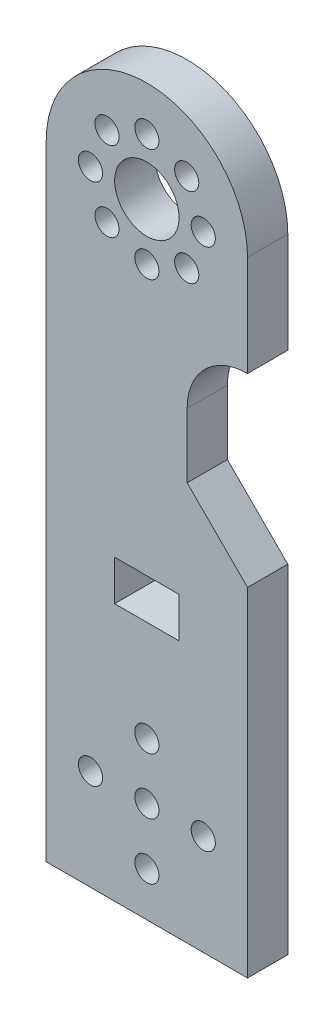
ISO-10303-21;
HEADER;
FILE_DESCRIPTION(('STEP AP214'),'2;1');
FILE_NAME('part.step','',(''),(''),'','','');
FILE_SCHEMA(('AUTOMOTIVE_DESIGN { 1 0 10303 214 1 1 1 1 }'));
ENDSEC;
DATA;
#1=APPLICATION_CONTEXT('core data for automotive mechanical design processes');
#2=APPLICATION_PROTOCOL_DEFINITION('international standard','automotive_design',2000,#1);
#3=PRODUCT_CONTEXT('',#1,'mechanical');
#4=PRODUCT('Part','Part','',(#3));
#5=PRODUCT_RELATED_PRODUCT_CATEGORY('part','',(#4));
#6=PRODUCT_DEFINITION_FORMATION('','',#4);
#7=PRODUCT_DEFINITION_CONTEXT('part definition',#1,'design');
#8=PRODUCT_DEFINITION('design','',#6,#7);
#9=PRODUCT_DEFINITION_SHAPE('','',#8);
#10=(LENGTH_UNIT() NAMED_UNIT(*) SI_UNIT(.MILLI.,.METRE.));
#11=(NAMED_UNIT(*) PLANE_ANGLE_UNIT() SI_UNIT($,.RADIAN.));
#12=(NAMED_UNIT(*) SI_UNIT($,.STERADIAN.) SOLID_ANGLE_UNIT());
#13=UNCERTAINTY_MEASURE_WITH_UNIT(LENGTH_MEASURE(1.E-05),#10,'distance_accuracy_value','');
#14=(GEOMETRIC_REPRESENTATION_CONTEXT(3) GLOBAL_UNCERTAINTY_ASSIGNED_CONTEXT((#13)) GLOBAL_UNIT_ASSIGNED_CONTEXT((#10,
#11,#12)) REPRESENTATION_CONTEXT('',''));
#15=CARTESIAN_POINT('',(0.,0.,0.));
#16=DIRECTION('',(0.,0.,1.));
#17=DIRECTION('',(1.,0.,0.));
#18=AXIS2_PLACEMENT_3D('',#15,#16,#17);
#19=CARTESIAN_POINT('',(12.5,0.,5.));
#20=DIRECTION('',(1.,0.,0.));
#21=DIRECTION('',(0.,1.,0.));
#22=AXIS2_PLACEMENT_3D('',#19,#20,#21);
#23=PLANE('',#22);
#24=DIRECTION('',(0.,0.,1.));
#25=VECTOR('',#24,1.);
#26=CARTESIAN_POINT('',(12.5,-12.5,-5.));
#27=LINE('',#26,#25);
#28=CARTESIAN_POINT('',(12.5,-12.5,0.));
#29=VERTEX_POINT('',#28);
#30=CARTESIAN_POINT('',(12.5,-12.5,5.));
#31=VERTEX_POINT('',#30);
#32=EDGE_CURVE('E145',#29,#31,#27,.T.);
#33=ORIENTED_EDGE('',*,*,#32,.F.);
#34=DIRECTION('',(0.,-1.,0.));
#35=VECTOR('',#34,1.);
#36=CARTESIAN_POINT('',(12.5,0.,0.));
#37=LINE('',#36,#35);
#38=CARTESIAN_POINT('',(12.5,0.,0.));
#39=VERTEX_POINT('',#38);
#40=EDGE_CURVE('E195',#39,#29,#37,.T.);
#41=ORIENTED_EDGE('',*,*,#40,.F.);
#42=DIRECTION('',(0.,0.,-1.));
#43=VECTOR('',#42,1.);
#44=CARTESIAN_POINT('',(12.5,0.,5.));
#45=LINE('',#44,#43);
#46=CARTESIAN_POINT('',(12.5,0.,5.));
#47=VERTEX_POINT('',#46);
#48=EDGE_CURVE('E215',#47,#39,#45,.T.);
#49=ORIENTED_EDGE('',*,*,#48,.F.);
#50=DIRECTION('',(0.,-1.,0.));
#51=VECTOR('',#50,1.);
#52=CARTESIAN_POINT('',(12.5,0.,5.));
#53=LINE('',#52,#51);
#54=EDGE_CURVE('E151',#47,#31,#53,.T.);
#55=ORIENTED_EDGE('',*,*,#54,.T.);
#56=EDGE_LOOP('',(#33,#41,#49,#55));
#57=FACE_BOUND('',#56,.T.);
#58=ADVANCED_FACE('F36',(#57),#23,.T.);
#59=CARTESIAN_POINT('',(0.,0.,5.));
#60=DIRECTION('',(0.,0.,1.));
#61=DIRECTION('',(1.,0.,0.));
#62=AXIS2_PLACEMENT_3D('',#59,#60,#61);
#63=PLANE('',#62);
#64=DIRECTION('',(0.707106781186549,-0.707106781186546,0.));
#65=VECTOR('',#64,1.);
#66=CARTESIAN_POINT('',(5.,-28.,5.));
#67=LINE('',#66,#65);
#68=CARTESIAN_POINT('',(5.,-28.,5.));
#69=VERTEX_POINT('',#68);
#70=CARTESIAN_POINT('',(12.5,-35.5,5.));
#71=VERTEX_POINT('',#70);
#72=EDGE_CURVE('E126',#69,#71,#67,.T.);
#73=ORIENTED_EDGE('',*,*,#72,.F.);
#74=DIRECTION('',(0.,-1.,0.));
#75=VECTOR('',#74,1.);
#76=CARTESIAN_POINT('',(5.,-20.0000000000001,5.));
#77=LINE('',#76,#75);
#78=CARTESIAN_POINT('',(5.,-20.0000000000001,5.));
#79=VERTEX_POINT('',#78);
#80=EDGE_CURVE('E136',#79,#69,#77,.T.);
#81=ORIENTED_EDGE('',*,*,#80,.F.);
#82=CARTESIAN_POINT('',(12.5,-20.,5.));
#83=DIRECTION('',(0.,0.,1.));
#84=DIRECTION('',(1.,0.,0.));
#85=AXIS2_PLACEMENT_3D('',#82,#83,#84);
#86=CIRCLE('',#85,7.5);
#87=EDGE_CURVE('E248',#31,#79,#86,.T.);
#88=ORIENTED_EDGE('',*,*,#87,.F.);
#89=ORIENTED_EDGE('',*,*,#54,.F.);
#90=CARTESIAN_POINT('',(0.,0.,5.));
#91=DIRECTION('',(0.,0.,1.));
#92=DIRECTION('',(1.,0.,0.));
#93=AXIS2_PLACEMENT_3D('',#90,#91,#92);
#94=CIRCLE('',#93,12.5);
#95=CARTESIAN_POINT('',(-12.5,0.,5.));
#96=VERTEX_POINT('',#95);
#97=EDGE_CURVE('E155',#47,#96,#94,.T.);
#98=ORIENTED_EDGE('',*,*,#97,.T.);
#99=DIRECTION('',(0.,-1.,0.));
#100=VECTOR('',#99,1.);
#101=CARTESIAN_POINT('',(-12.5,0.,5.));
#102=LINE('',#101,#100);
#103=CARTESIAN_POINT('',(-12.5,-77.5,5.));
#104=VERTEX_POINT('',#103);
#105=EDGE_CURVE('E163',#96,#104,#102,.T.);
#106=ORIENTED_EDGE('',*,*,#105,.T.);
#107=DIRECTION('',(1.,0.,0.));
#108=VECTOR('',#107,1.);
#109=CARTESIAN_POINT('',(0.,-77.5,5.));
#110=LINE('',#109,#108);
#111=CARTESIAN_POINT('',(12.5,-77.5,5.));
#112=VERTEX_POINT('',#111);
#113=EDGE_CURVE('E149',#104,#112,#110,.T.);
#114=ORIENTED_EDGE('',*,*,#113,.T.);
#115=EDGE_CURVE('E142',#71,#112,#53,.T.);
#116=ORIENTED_EDGE('',*,*,#115,.F.);
#117=EDGE_LOOP('',(#73,#81,#88,#89,#98,#106,#114,#116));
#118=FACE_BOUND('',#117,.T.);
#119=CARTESIAN_POINT('',(7.,-65.,5.));
#120=DIRECTION('',(0.,0.,-1.));
#121=DIRECTION('',(-1.,0.,0.));
#122=AXIS2_PLACEMENT_3D('',#119,#120,#121);
#123=CIRCLE('',#122,1.5);
#124=CARTESIAN_POINT('',(5.50000000000001,-65.,5.));
#125=VERTEX_POINT('',#124);
#126=EDGE_CURVE('E277',#125,#125,#123,.T.);
#127=ORIENTED_EDGE('',*,*,#126,.T.);
#128=EDGE_LOOP('',(#127));
#129=FACE_BOUND('',#128,.T.);
#130=CARTESIAN_POINT('',(-4.94974746830577,4.94974746830589,5.));
#131=DIRECTION('',(0.,0.,1.));
#132=DIRECTION('',(1.,0.,0.));
#133=AXIS2_PLACEMENT_3D('',#130,#131,#132);
#134=CIRCLE('',#133,1.5);
#135=CARTESIAN_POINT('',(-3.44974746830577,4.94974746830589,5.));
#136=VERTEX_POINT('',#135);
#137=EDGE_CURVE('E152',#136,#136,#134,.T.);
#138=ORIENTED_EDGE('',*,*,#137,.F.);
#139=EDGE_LOOP('',(#138));
#140=FACE_BOUND('',#139,.T.);
#141=CARTESIAN_POINT('',(-6.9999999999998,-1.98523339633126E-13,5.));
#142=DIRECTION('',(0.,0.,1.));
#143=DIRECTION('',(1.,0.,0.));
#144=AXIS2_PLACEMENT_3D('',#141,#142,#143);
#145=CIRCLE('',#144,1.50000000000032);
#146=CARTESIAN_POINT('',(-5.49999999999948,-1.98523339633126E-13,5.));
#147=VERTEX_POINT('',#146);
#148=EDGE_CURVE('E157',#147,#147,#145,.T.);
#149=ORIENTED_EDGE('',*,*,#148,.F.);
#150=EDGE_LOOP('',(#149));
#151=FACE_BOUND('',#150,.T.);
#152=CARTESIAN_POINT('',(-4.9497474683055,-4.94974746830597,5.));
#153=DIRECTION('',(0.,0.,1.));
#154=DIRECTION('',(1.,0.,0.));
#155=AXIS2_PLACEMENT_3D('',#152,#153,#154);
#156=CIRCLE('',#155,1.50000000000042);
#157=CARTESIAN_POINT('',(-3.44974746830507,-4.94974746830597,5.));
#158=VERTEX_POINT('',#157);
#159=EDGE_CURVE('E320',#158,#158,#156,.T.);
#160=ORIENTED_EDGE('',*,*,#159,.F.);
#161=EDGE_LOOP('',(#160));
#162=FACE_BOUND('',#161,.T.);
#163=CARTESIAN_POINT('',(3.95332173747447E-13,-7.,5.));
#164=DIRECTION('',(0.,0.,1.));
#165=DIRECTION('',(1.,0.,0.));
#166=AXIS2_PLACEMENT_3D('',#163,#164,#165);
#167=CIRCLE('',#166,1.50000000000042);
#168=CARTESIAN_POINT('',(1.50000000000082,-7.,5.));
#169=VERTEX_POINT('',#168);
#170=EDGE_CURVE('E317',#169,#169,#167,.T.);
#171=ORIENTED_EDGE('',*,*,#170,.F.);
#172=EDGE_LOOP('',(#171));
#173=FACE_BOUND('',#172,.T.);
#174=CARTESIAN_POINT('',(4.94974746830617,-4.94974746830569,5.));
#175=DIRECTION('',(0.,0.,1.));
#176=DIRECTION('',(1.,0.,0.));
#177=AXIS2_PLACEMENT_3D('',#174,#175,#176);
#178=CIRCLE('',#177,1.50000000000032);
#179=CARTESIAN_POINT('',(6.44974746830649,-4.94974746830569,5.));
#180=VERTEX_POINT('',#179);
#181=EDGE_CURVE('E314',#180,#180,#178,.T.);
#182=ORIENTED_EDGE('',*,*,#181,.F.);
#183=EDGE_LOOP('',(#182));
#184=FACE_BOUND('',#183,.T.);
#185=CARTESIAN_POINT('',(7.0000000000002,1.97666086873723E-13,5.));
#186=DIRECTION('',(0.,0.,1.));
#187=DIRECTION('',(1.,0.,0.));
#188=AXIS2_PLACEMENT_3D('',#185,#186,#187);
#189=CIRCLE('',#188,1.50000000000015);
#190=CARTESIAN_POINT('',(8.50000000000035,1.97666086873723E-13,5.));
#191=VERTEX_POINT('',#190);
#192=EDGE_CURVE('E311',#191,#191,#189,.T.);
#193=ORIENTED_EDGE('',*,*,#192,.F.);
#194=EDGE_LOOP('',(#193));
#195=FACE_BOUND('',#194,.T.);
#196=CARTESIAN_POINT('',(4.94974746830584,4.94974746830582,5.));
#197=DIRECTION('',(0.,0.,1.));
#198=DIRECTION('',(1.,0.,0.));
#199=AXIS2_PLACEMENT_3D('',#196,#197,#198);
#200=CIRCLE('',#199,1.5);
#201=CARTESIAN_POINT('',(6.44974746830584,4.94974746830582,5.));
#202=VERTEX_POINT('',#201);
#203=EDGE_CURVE('E308',#202,#202,#200,.T.);
#204=ORIENTED_EDGE('',*,*,#203,.F.);
#205=EDGE_LOOP('',(#204));
#206=FACE_BOUND('',#205,.T.);
#207=CARTESIAN_POINT('',(0.,7.,5.));
#208=DIRECTION('',(0.,0.,1.));
#209=DIRECTION('',(1.,0.,0.));
#210=AXIS2_PLACEMENT_3D('',#207,#208,#209);
#211=CIRCLE('',#210,1.5);
#212=CARTESIAN_POINT('',(1.5,7.,5.));
#213=VERTEX_POINT('',#212);
#214=EDGE_CURVE('E305',#213,#213,#211,.T.);
#215=ORIENTED_EDGE('',*,*,#214,.F.);
#216=EDGE_LOOP('',(#215));
#217=FACE_BOUND('',#216,.T.);
#218=CARTESIAN_POINT('',(0.,0.,5.));
#219=DIRECTION('',(0.,0.,1.));
#220=DIRECTION('',(1.,0.,0.));
#221=AXIS2_PLACEMENT_3D('',#218,#219,#220);
#222=CIRCLE('',#221,4.);
#223=CARTESIAN_POINT('',(4.,0.,5.));
#224=VERTEX_POINT('',#223);
#225=EDGE_CURVE('E207',#224,#224,#222,.T.);
#226=ORIENTED_EDGE('',*,*,#225,.F.);
#227=EDGE_LOOP('',(#226));
#228=FACE_BOUND('',#227,.T.);
#229=DIRECTION('',(0.,1.,0.));
#230=VECTOR('',#229,1.);
#231=CARTESIAN_POINT('',(4.,-40.5000000000002,5.));
#232=LINE('',#231,#230);
#233=CARTESIAN_POINT('',(4.,-45.5000000000002,5.));
#234=VERTEX_POINT('',#233);
#235=CARTESIAN_POINT('',(4.,-40.5000000000002,5.));
#236=VERTEX_POINT('',#235);
#237=EDGE_CURVE('E59',#234,#236,#232,.T.);
#238=ORIENTED_EDGE('',*,*,#237,.F.);
#239=DIRECTION('',(1.,0.,0.));
#240=VECTOR('',#239,1.);
#241=CARTESIAN_POINT('',(-4.,-45.5000000000002,5.));
#242=LINE('',#241,#240);
#243=CARTESIAN_POINT('',(-4.,-45.5000000000002,5.));
#244=VERTEX_POINT('',#243);
#245=EDGE_CURVE('E293',#244,#234,#242,.T.);
#246=ORIENTED_EDGE('',*,*,#245,.F.);
#247=DIRECTION('',(0.,-1.,0.));
#248=VECTOR('',#247,1.);
#249=CARTESIAN_POINT('',(-4.,-40.5000000000002,5.));
#250=LINE('',#249,#248);
#251=CARTESIAN_POINT('',(-4.,-40.5000000000002,5.));
#252=VERTEX_POINT('',#251);
#253=EDGE_CURVE('E290',#252,#244,#250,.T.);
#254=ORIENTED_EDGE('',*,*,#253,.F.);
#255=DIRECTION('',(-1.,0.,0.));
#256=VECTOR('',#255,1.);
#257=CARTESIAN_POINT('',(-4.,-40.5000000000002,5.));
#258=LINE('',#257,#256);
#259=EDGE_CURVE('E287',#236,#252,#258,.T.);
#260=ORIENTED_EDGE('',*,*,#259,.F.);
#261=EDGE_LOOP('',(#238,#246,#254,#260));
#262=FACE_BOUND('',#261,.T.);
#263=CARTESIAN_POINT('',(0.,-65.,5.));
#264=DIRECTION('',(0.,0.,1.));
#265=DIRECTION('',(1.,0.,0.));
#266=AXIS2_PLACEMENT_3D('',#263,#264,#265);
#267=CIRCLE('',#266,1.5);
#268=CARTESIAN_POINT('',(1.50000000000001,-65.,5.));
#269=VERTEX_POINT('',#268);
#270=EDGE_CURVE('E271',#269,#269,#267,.T.);
#271=ORIENTED_EDGE('',*,*,#270,.F.);
#272=EDGE_LOOP('',(#271));
#273=FACE_BOUND('',#272,.T.);
#274=CARTESIAN_POINT('',(-6.99999999999999,-65.,5.));
#275=DIRECTION('',(0.,0.,-1.));
#276=DIRECTION('',(-1.,0.,0.));
#277=AXIS2_PLACEMENT_3D('',#274,#275,#276);
#278=CIRCLE('',#277,1.5);
#279=CARTESIAN_POINT('',(-8.49999999999999,-65.,5.));
#280=VERTEX_POINT('',#279);
#281=EDGE_CURVE('E281',#280,#280,#278,.T.);
#282=ORIENTED_EDGE('',*,*,#281,.T.);
#283=EDGE_LOOP('',(#282));
#284=FACE_BOUND('',#283,.T.);
#285=CARTESIAN_POINT('',(0.,-58.,5.));
#286=DIRECTION('',(0.,0.,1.));
#287=DIRECTION('',(1.,0.,0.));
#288=AXIS2_PLACEMENT_3D('',#285,#286,#287);
#289=CIRCLE('',#288,1.5);
#290=CARTESIAN_POINT('',(1.5,-58.,5.));
#291=VERTEX_POINT('',#290);
#292=EDGE_CURVE('E268',#291,#291,#289,.T.);
#293=ORIENTED_EDGE('',*,*,#292,.F.);
#294=EDGE_LOOP('',(#293));
#295=FACE_BOUND('',#294,.T.);
#296=CARTESIAN_POINT('',(0.,-72.,5.));
#297=DIRECTION('',(0.,0.,-1.));
#298=DIRECTION('',(-1.,0.,0.));
#299=AXIS2_PLACEMENT_3D('',#296,#297,#298);
#300=CIRCLE('',#299,1.5);
#301=CARTESIAN_POINT('',(-1.5,-72.,5.));
#302=VERTEX_POINT('',#301);
#303=EDGE_CURVE('E233',#302,#302,#300,.T.);
#304=ORIENTED_EDGE('',*,*,#303,.T.);
#305=EDGE_LOOP('',(#304));
#306=FACE_BOUND('',#305,.T.);
#307=ADVANCED_FACE('F146',(#118,#129,#140,#151,#162,#173,#184,#195,#206,#217,#228,#262,#273,
#284,#295,#306),#63,.T.);
#308=CARTESIAN_POINT('',(0.,0.,0.));
#309=DIRECTION('',(0.,0.,1.));
#310=DIRECTION('',(1.,0.,0.));
#311=AXIS2_PLACEMENT_3D('',#308,#309,#310);
#312=PLANE('',#311);
#313=CARTESIAN_POINT('',(0.,-58.,0.));
#314=DIRECTION('',(0.,0.,1.));
#315=DIRECTION('',(1.,0.,0.));
#316=AXIS2_PLACEMENT_3D('',#313,#314,#315);
#317=CIRCLE('',#316,1.5);
#318=CARTESIAN_POINT('',(1.5,-58.,0.));
#319=VERTEX_POINT('',#318);
#320=EDGE_CURVE('E239',#319,#319,#317,.T.);
#321=ORIENTED_EDGE('',*,*,#320,.T.);
#322=EDGE_LOOP('',(#321));
#323=FACE_BOUND('',#322,.T.);
#324=CARTESIAN_POINT('',(0.,-65.,0.));
#325=DIRECTION('',(0.,0.,1.));
#326=DIRECTION('',(1.,0.,0.));
#327=AXIS2_PLACEMENT_3D('',#324,#325,#326);
#328=CIRCLE('',#327,1.5);
#329=CARTESIAN_POINT('',(1.50000000000001,-65.,0.));
#330=VERTEX_POINT('',#329);
#331=EDGE_CURVE('E229',#330,#330,#328,.T.);
#332=ORIENTED_EDGE('',*,*,#331,.T.);
#333=EDGE_LOOP('',(#332));
#334=FACE_BOUND('',#333,.T.);
#335=DIRECTION('',(1.,0.,0.));
#336=VECTOR('',#335,1.);
#337=CARTESIAN_POINT('',(0.,-45.5000000000002,0.));
#338=LINE('',#337,#336);
#339=CARTESIAN_POINT('',(-4.,-45.5000000000002,0.));
#340=VERTEX_POINT('',#339);
#341=CARTESIAN_POINT('',(4.,-45.5000000000002,0.));
#342=VERTEX_POINT('',#341);
#343=EDGE_CURVE('E223',#340,#342,#338,.T.);
#344=ORIENTED_EDGE('',*,*,#343,.T.);
#345=DIRECTION('',(0.,1.,0.));
#346=VECTOR('',#345,1.);
#347=CARTESIAN_POINT('',(4.,0.,0.));
#348=LINE('',#347,#346);
#349=CARTESIAN_POINT('',(4.,-40.5000000000002,0.));
#350=VERTEX_POINT('',#349);
#351=EDGE_CURVE('E226',#342,#350,#348,.T.);
#352=ORIENTED_EDGE('',*,*,#351,.T.);
#353=DIRECTION('',(-1.,0.,0.));
#354=VECTOR('',#353,1.);
#355=CARTESIAN_POINT('',(0.,-40.5000000000002,0.));
#356=LINE('',#355,#354);
#357=CARTESIAN_POINT('',(-4.,-40.5000000000002,0.));
#358=VERTEX_POINT('',#357);
#359=EDGE_CURVE('E217',#350,#358,#356,.T.);
#360=ORIENTED_EDGE('',*,*,#359,.T.);
#361=DIRECTION('',(0.,-1.,0.));
#362=VECTOR('',#361,1.);
#363=CARTESIAN_POINT('',(-4.,0.,0.));
#364=LINE('',#363,#362);
#365=EDGE_CURVE('E220',#358,#340,#364,.T.);
#366=ORIENTED_EDGE('',*,*,#365,.T.);
#367=EDGE_LOOP('',(#344,#352,#360,#366));
#368=FACE_BOUND('',#367,.T.);
#369=CARTESIAN_POINT('',(0.,0.,0.));
#370=DIRECTION('',(0.,0.,1.));
#371=DIRECTION('',(1.,0.,0.));
#372=AXIS2_PLACEMENT_3D('',#369,#370,#371);
#373=CIRCLE('',#372,4.);
#374=CARTESIAN_POINT('',(4.,0.,0.));
#375=VERTEX_POINT('',#374);
#376=EDGE_CURVE('E167',#375,#375,#373,.T.);
#377=ORIENTED_EDGE('',*,*,#376,.T.);
#378=EDGE_LOOP('',(#377));
#379=FACE_BOUND('',#378,.T.);
#380=CARTESIAN_POINT('',(0.,7.,0.));
#381=DIRECTION('',(0.,0.,1.));
#382=DIRECTION('',(1.,0.,0.));
#383=AXIS2_PLACEMENT_3D('',#380,#381,#382);
#384=CIRCLE('',#383,1.5);
#385=CARTESIAN_POINT('',(1.5,7.,0.));
#386=VERTEX_POINT('',#385);
#387=EDGE_CURVE('E170',#386,#386,#384,.T.);
#388=ORIENTED_EDGE('',*,*,#387,.T.);
#389=EDGE_LOOP('',(#388));
#390=FACE_BOUND('',#389,.T.);
#391=CARTESIAN_POINT('',(4.94974746830584,4.94974746830582,0.));
#392=DIRECTION('',(0.,0.,1.));
#393=DIRECTION('',(1.,0.,0.));
#394=AXIS2_PLACEMENT_3D('',#391,#392,#393);
#395=CIRCLE('',#394,1.5);
#396=CARTESIAN_POINT('',(6.44974746830584,4.94974746830582,0.));
#397=VERTEX_POINT('',#396);
#398=EDGE_CURVE('E174',#397,#397,#395,.T.);
#399=ORIENTED_EDGE('',*,*,#398,.T.);
#400=EDGE_LOOP('',(#399));
#401=FACE_BOUND('',#400,.T.);
#402=CARTESIAN_POINT('',(7.0000000000002,1.97666086873723E-13,0.));
#403=DIRECTION('',(0.,0.,1.));
#404=DIRECTION('',(1.,0.,0.));
#405=AXIS2_PLACEMENT_3D('',#402,#403,#404);
#406=CIRCLE('',#405,1.50000000000015);
#407=CARTESIAN_POINT('',(8.50000000000035,1.97666086873723E-13,0.));
#408=VERTEX_POINT('',#407);
#409=EDGE_CURVE('E177',#408,#408,#406,.T.);
#410=ORIENTED_EDGE('',*,*,#409,.T.);
#411=EDGE_LOOP('',(#410));
#412=FACE_BOUND('',#411,.T.);
#413=CARTESIAN_POINT('',(4.94974746830617,-4.94974746830569,0.));
#414=DIRECTION('',(0.,0.,1.));
#415=DIRECTION('',(1.,0.,0.));
#416=AXIS2_PLACEMENT_3D('',#413,#414,#415);
#417=CIRCLE('',#416,1.50000000000032);
#418=CARTESIAN_POINT('',(6.44974746830649,-4.94974746830569,0.));
#419=VERTEX_POINT('',#418);
#420=EDGE_CURVE('E180',#419,#419,#417,.T.);
#421=ORIENTED_EDGE('',*,*,#420,.T.);
#422=EDGE_LOOP('',(#421));
#423=FACE_BOUND('',#422,.T.);
#424=CARTESIAN_POINT('',(3.95332173747447E-13,-7.,0.));
#425=DIRECTION('',(0.,0.,1.));
#426=DIRECTION('',(1.,0.,0.));
#427=AXIS2_PLACEMENT_3D('',#424,#425,#426);
#428=CIRCLE('',#427,1.50000000000042);
#429=CARTESIAN_POINT('',(1.50000000000082,-7.,0.));
#430=VERTEX_POINT('',#429);
#431=EDGE_CURVE('E183',#430,#430,#428,.T.);
#432=ORIENTED_EDGE('',*,*,#431,.T.);
#433=EDGE_LOOP('',(#432));
#434=FACE_BOUND('',#433,.T.);
#435=CARTESIAN_POINT('',(-4.9497474683055,-4.94974746830597,0.));
#436=DIRECTION('',(0.,0.,1.));
#437=DIRECTION('',(1.,0.,0.));
#438=AXIS2_PLACEMENT_3D('',#435,#436,#437);
#439=CIRCLE('',#438,1.50000000000042);
#440=CARTESIAN_POINT('',(-3.44974746830507,-4.94974746830597,0.));
#441=VERTEX_POINT('',#440);
#442=EDGE_CURVE('E186',#441,#441,#439,.T.);
#443=ORIENTED_EDGE('',*,*,#442,.T.);
#444=EDGE_LOOP('',(#443));
#445=FACE_BOUND('',#444,.T.);
#446=CARTESIAN_POINT('',(-6.9999999999998,-1.98523339633126E-13,0.));
#447=DIRECTION('',(0.,0.,1.));
#448=DIRECTION('',(1.,0.,0.));
#449=AXIS2_PLACEMENT_3D('',#446,#447,#448);
#450=CIRCLE('',#449,1.50000000000032);
#451=CARTESIAN_POINT('',(-5.49999999999948,-1.98523339633126E-13,0.));
#452=VERTEX_POINT('',#451);
#453=EDGE_CURVE('E189',#452,#452,#450,.T.);
#454=ORIENTED_EDGE('',*,*,#453,.T.);
#455=EDGE_LOOP('',(#454));
#456=FACE_BOUND('',#455,.T.);
#457=CARTESIAN_POINT('',(-4.94974746830577,4.94974746830589,0.));
#458=DIRECTION('',(0.,0.,1.));
#459=DIRECTION('',(1.,0.,0.));
#460=AXIS2_PLACEMENT_3D('',#457,#458,#459);
#461=CIRCLE('',#460,1.5);
#462=CARTESIAN_POINT('',(-3.44974746830577,4.94974746830589,0.));
#463=VERTEX_POINT('',#462);
#464=EDGE_CURVE('E192',#463,#463,#461,.T.);
#465=ORIENTED_EDGE('',*,*,#464,.T.);
#466=EDGE_LOOP('',(#465));
#467=FACE_BOUND('',#466,.T.);
#468=DIRECTION('',(0.,-1.,0.));
#469=VECTOR('',#468,1.);
#470=CARTESIAN_POINT('',(5.,0.,0.));
#471=LINE('',#470,#469);
#472=CARTESIAN_POINT('',(5.,-20.0000000000001,0.));
#473=VERTEX_POINT('',#472);
#474=CARTESIAN_POINT('',(5.,-28.,0.));
#475=VERTEX_POINT('',#474);
#476=EDGE_CURVE('E11',#473,#475,#471,.T.);
#477=ORIENTED_EDGE('',*,*,#476,.T.);
#478=DIRECTION('',(0.707106781186549,-0.707106781186546,0.));
#479=VECTOR('',#478,1.);
#480=CARTESIAN_POINT('',(-11.5,-11.5,0.));
#481=LINE('',#480,#479);
#482=CARTESIAN_POINT('',(12.5,-35.5,0.));
#483=VERTEX_POINT('',#482);
#484=EDGE_CURVE('E267',#475,#483,#481,.T.);
#485=ORIENTED_EDGE('',*,*,#484,.T.);
#486=CARTESIAN_POINT('',(12.5,-77.5,0.));
#487=VERTEX_POINT('',#486);
#488=EDGE_CURVE('E144',#483,#487,#37,.T.);
#489=ORIENTED_EDGE('',*,*,#488,.T.);
#490=DIRECTION('',(1.,0.,0.));
#491=VECTOR('',#490,1.);
#492=CARTESIAN_POINT('',(0.,-77.5,0.));
#493=LINE('',#492,#491);
#494=CARTESIAN_POINT('',(-12.5,-77.5,0.));
#495=VERTEX_POINT('',#494);
#496=EDGE_CURVE('E204',#495,#487,#493,.T.);
#497=ORIENTED_EDGE('',*,*,#496,.F.);
#498=DIRECTION('',(0.,-1.,0.));
#499=VECTOR('',#498,1.);
#500=CARTESIAN_POINT('',(-12.5,0.,0.));
#501=LINE('',#500,#499);
#502=CARTESIAN_POINT('',(-12.5,0.,0.));
#503=VERTEX_POINT('',#502);
#504=EDGE_CURVE('E201',#503,#495,#501,.T.);
#505=ORIENTED_EDGE('',*,*,#504,.F.);
#506=CARTESIAN_POINT('',(0.,0.,0.));
#507=DIRECTION('',(0.,0.,1.));
#508=DIRECTION('',(1.,0.,0.));
#509=AXIS2_PLACEMENT_3D('',#506,#507,#508);
#510=CIRCLE('',#509,12.5);
#511=EDGE_CURVE('E198',#39,#503,#510,.T.);
#512=ORIENTED_EDGE('',*,*,#511,.F.);
#513=ORIENTED_EDGE('',*,*,#40,.T.);
#514=CARTESIAN_POINT('',(12.5,-20.,0.));
#515=DIRECTION('',(0.,0.,1.));
#516=DIRECTION('',(1.,0.,0.));
#517=AXIS2_PLACEMENT_3D('',#514,#515,#516);
#518=CIRCLE('',#517,7.5);
#519=EDGE_CURVE('E51',#29,#473,#518,.T.);
#520=ORIENTED_EDGE('',*,*,#519,.T.);
#521=EDGE_LOOP('',(#477,#485,#489,#497,#505,#512,#513,#520));
#522=FACE_BOUND('',#521,.T.);
#523=CARTESIAN_POINT('',(-6.99999999999999,-65.,0.));
#524=DIRECTION('',(0.,0.,1.));
#525=DIRECTION('',(1.,0.,0.));
#526=AXIS2_PLACEMENT_3D('',#523,#524,#525);
#527=CIRCLE('',#526,1.5);
#528=CARTESIAN_POINT('',(-5.5,-65.,0.));
#529=VERTEX_POINT('',#528);
#530=EDGE_CURVE('E232',#529,#529,#527,.F.);
#531=ORIENTED_EDGE('',*,*,#530,.F.);
#532=EDGE_LOOP('',(#531));
#533=FACE_BOUND('',#532,.T.);
#534=CARTESIAN_POINT('',(7.,-65.,0.));
#535=DIRECTION('',(0.,0.,1.));
#536=DIRECTION('',(1.,0.,0.));
#537=AXIS2_PLACEMENT_3D('',#534,#535,#536);
#538=CIRCLE('',#537,1.5);
#539=CARTESIAN_POINT('',(8.5,-65.,0.));
#540=VERTEX_POINT('',#539);
#541=EDGE_CURVE('E236',#540,#540,#538,.F.);
#542=ORIENTED_EDGE('',*,*,#541,.F.);
#543=EDGE_LOOP('',(#542));
#544=FACE_BOUND('',#543,.T.);
#545=CARTESIAN_POINT('',(0.,-72.,0.));
#546=DIRECTION('',(0.,0.,1.));
#547=DIRECTION('',(1.,0.,0.));
#548=AXIS2_PLACEMENT_3D('',#545,#546,#547);
#549=CIRCLE('',#548,1.5);
#550=CARTESIAN_POINT('',(1.5,-72.,0.));
#551=VERTEX_POINT('',#550);
#552=EDGE_CURVE('E242',#551,#551,#549,.F.);
#553=ORIENTED_EDGE('',*,*,#552,.F.);
#554=EDGE_LOOP('',(#553));
#555=FACE_BOUND('',#554,.T.);
#556=ADVANCED_FACE('F265',(#323,#334,#368,#379,#390,#401,#412,#423,#434,#445,#456,#467,#522,
#533,#544,#555),#312,.F.);
#557=DIRECTION('',(0.,0.,-1.));
#558=VECTOR('',#557,1.);
#559=CARTESIAN_POINT('',(12.5,-35.5,5.));
#560=LINE('',#559,#558);
#561=EDGE_CURVE('E44',#71,#483,#560,.T.);
#562=ORIENTED_EDGE('',*,*,#561,.F.);
#563=ORIENTED_EDGE('',*,*,#115,.T.);
#564=DIRECTION('',(0.,0.,-1.));
#565=VECTOR('',#564,1.);
#566=CARTESIAN_POINT('',(12.5,-77.5,5.));
#567=LINE('',#566,#565);
#568=EDGE_CURVE('E166',#112,#487,#567,.T.);
#569=ORIENTED_EDGE('',*,*,#568,.T.);
#570=ORIENTED_EDGE('',*,*,#488,.F.);
#571=EDGE_LOOP('',(#562,#563,#569,#570));
#572=FACE_BOUND('',#571,.T.);
#573=ADVANCED_FACE('F140',(#572),#23,.T.);
#574=CARTESIAN_POINT('',(0.,0.,5.));
#575=DIRECTION('',(0.,0.,-1.));
#576=DIRECTION('',(-1.,0.,0.));
#577=AXIS2_PLACEMENT_3D('',#574,#575,#576);
#578=CYLINDRICAL_SURFACE('',#577,12.5);
#579=ORIENTED_EDGE('',*,*,#511,.T.);
#580=DIRECTION('',(0.,0.,-1.));
#581=VECTOR('',#580,1.);
#582=CARTESIAN_POINT('',(-12.5,0.,5.));
#583=LINE('',#582,#581);
#584=EDGE_CURVE('E212',#96,#503,#583,.T.);
#585=ORIENTED_EDGE('',*,*,#584,.F.);
#586=ORIENTED_EDGE('',*,*,#97,.F.);
#587=ORIENTED_EDGE('',*,*,#48,.T.);
#588=EDGE_LOOP('',(#579,#585,#586,#587));
#589=FACE_BOUND('',#588,.T.);
#590=ADVANCED_FACE('F258',(#589),#578,.T.);
#591=CARTESIAN_POINT('',(-12.5,0.,5.));
#592=DIRECTION('',(1.,0.,0.));
#593=DIRECTION('',(0.,1.,0.));
#594=AXIS2_PLACEMENT_3D('',#591,#592,#593);
#595=PLANE('',#594);
#596=ORIENTED_EDGE('',*,*,#504,.T.);
#597=DIRECTION('',(0.,0.,-1.));
#598=VECTOR('',#597,1.);
#599=CARTESIAN_POINT('',(-12.5,-77.5,5.));
#600=LINE('',#599,#598);
#601=EDGE_CURVE('E209',#104,#495,#600,.T.);
#602=ORIENTED_EDGE('',*,*,#601,.F.);
#603=ORIENTED_EDGE('',*,*,#105,.F.);
#604=ORIENTED_EDGE('',*,*,#584,.T.);
#605=EDGE_LOOP('',(#596,#602,#603,#604));
#606=FACE_BOUND('',#605,.T.);
#607=ADVANCED_FACE('F261',(#606),#595,.F.);
#608=CARTESIAN_POINT('',(-4.94974746830577,4.94974746830589,5.));
#609=DIRECTION('',(0.,0.,-1.));
#610=DIRECTION('',(-1.,0.,0.));
#611=AXIS2_PLACEMENT_3D('',#608,#609,#610);
#612=CYLINDRICAL_SURFACE('',#611,1.5);
#613=ORIENTED_EDGE('',*,*,#137,.T.);
#614=EDGE_LOOP('',(#613));
#615=FACE_BOUND('',#614,.T.);
#616=ORIENTED_EDGE('',*,*,#464,.F.);
#617=EDGE_LOOP('',(#616));
#618=FACE_BOUND('',#617,.T.);
#619=ADVANCED_FACE('F379',(#615,#618),#612,.F.);
#620=CARTESIAN_POINT('',(-6.9999999999998,-1.98523339633126E-13,5.));
#621=DIRECTION('',(0.,0.,-1.));
#622=DIRECTION('',(-1.,0.,0.));
#623=AXIS2_PLACEMENT_3D('',#620,#621,#622);
#624=CYLINDRICAL_SURFACE('',#623,1.50000000000032);
#625=ORIENTED_EDGE('',*,*,#148,.T.);
#626=EDGE_LOOP('',(#625));
#627=FACE_BOUND('',#626,.T.);
#628=ORIENTED_EDGE('',*,*,#453,.F.);
#629=EDGE_LOOP('',(#628));
#630=FACE_BOUND('',#629,.T.);
#631=ADVANCED_FACE('F325',(#627,#630),#624,.F.);
#632=CARTESIAN_POINT('',(-4.9497474683055,-4.94974746830597,5.));
#633=DIRECTION('',(0.,0.,-1.));
#634=DIRECTION('',(-1.,0.,0.));
#635=AXIS2_PLACEMENT_3D('',#632,#633,#634);
#636=CYLINDRICAL_SURFACE('',#635,1.50000000000042);
#637=ORIENTED_EDGE('',*,*,#159,.T.);
#638=EDGE_LOOP('',(#637));
#639=FACE_BOUND('',#638,.T.);
#640=ORIENTED_EDGE('',*,*,#442,.F.);
#641=EDGE_LOOP('',(#640));
#642=FACE_BOUND('',#641,.T.);
#643=ADVANCED_FACE('F385',(#639,#642),#636,.F.);
#644=CARTESIAN_POINT('',(3.95332173747447E-13,-7.,5.));
#645=DIRECTION('',(0.,0.,-1.));
#646=DIRECTION('',(-1.,0.,0.));
#647=AXIS2_PLACEMENT_3D('',#644,#645,#646);
#648=CYLINDRICAL_SURFACE('',#647,1.50000000000042);
#649=ORIENTED_EDGE('',*,*,#170,.T.);
#650=EDGE_LOOP('',(#649));
#651=FACE_BOUND('',#650,.T.);
#652=ORIENTED_EDGE('',*,*,#431,.F.);
#653=EDGE_LOOP('',(#652));
#654=FACE_BOUND('',#653,.T.);
#655=ADVANCED_FACE('F388',(#651,#654),#648,.F.);
#656=CARTESIAN_POINT('',(4.94974746830617,-4.94974746830569,5.));
#657=DIRECTION('',(0.,0.,-1.));
#658=DIRECTION('',(-1.,0.,0.));
#659=AXIS2_PLACEMENT_3D('',#656,#657,#658);
#660=CYLINDRICAL_SURFACE('',#659,1.50000000000032);
#661=ORIENTED_EDGE('',*,*,#181,.T.);
#662=EDGE_LOOP('',(#661));
#663=FACE_BOUND('',#662,.T.);
#664=ORIENTED_EDGE('',*,*,#420,.F.);
#665=EDGE_LOOP('',(#664));
#666=FACE_BOUND('',#665,.T.);
#667=ADVANCED_FACE('F392',(#663,#666),#660,.F.);
#668=CARTESIAN_POINT('',(7.0000000000002,1.97666086873723E-13,5.));
#669=DIRECTION('',(0.,0.,-1.));
#670=DIRECTION('',(-1.,0.,0.));
#671=AXIS2_PLACEMENT_3D('',#668,#669,#670);
#672=CYLINDRICAL_SURFACE('',#671,1.50000000000015);
#673=ORIENTED_EDGE('',*,*,#192,.T.);
#674=EDGE_LOOP('',(#673));
#675=FACE_BOUND('',#674,.T.);
#676=ORIENTED_EDGE('',*,*,#409,.F.);
#677=EDGE_LOOP('',(#676));
#678=FACE_BOUND('',#677,.T.);
#679=ADVANCED_FACE('F396',(#675,#678),#672,.F.);
#680=CARTESIAN_POINT('',(4.94974746830584,4.94974746830582,5.));
#681=DIRECTION('',(0.,0.,-1.));
#682=DIRECTION('',(-1.,0.,0.));
#683=AXIS2_PLACEMENT_3D('',#680,#681,#682);
#684=CYLINDRICAL_SURFACE('',#683,1.5);
#685=ORIENTED_EDGE('',*,*,#203,.T.);
#686=EDGE_LOOP('',(#685));
#687=FACE_BOUND('',#686,.T.);
#688=ORIENTED_EDGE('',*,*,#398,.F.);
#689=EDGE_LOOP('',(#688));
#690=FACE_BOUND('',#689,.T.);
#691=ADVANCED_FACE('F400',(#687,#690),#684,.F.);
#692=CARTESIAN_POINT('',(0.,7.,5.));
#693=DIRECTION('',(0.,0.,-1.));
#694=DIRECTION('',(-1.,0.,0.));
#695=AXIS2_PLACEMENT_3D('',#692,#693,#694);
#696=CYLINDRICAL_SURFACE('',#695,1.5);
#697=ORIENTED_EDGE('',*,*,#214,.T.);
#698=EDGE_LOOP('',(#697));
#699=FACE_BOUND('',#698,.T.);
#700=ORIENTED_EDGE('',*,*,#387,.F.);
#701=EDGE_LOOP('',(#700));
#702=FACE_BOUND('',#701,.T.);
#703=ADVANCED_FACE('F403',(#699,#702),#696,.F.);
#704=CARTESIAN_POINT('',(0.,0.,5.));
#705=DIRECTION('',(0.,0.,-1.));
#706=DIRECTION('',(-1.,0.,0.));
#707=AXIS2_PLACEMENT_3D('',#704,#705,#706);
#708=CYLINDRICAL_SURFACE('',#707,4.);
#709=ORIENTED_EDGE('',*,*,#225,.T.);
#710=EDGE_LOOP('',(#709));
#711=FACE_BOUND('',#710,.T.);
#712=ORIENTED_EDGE('',*,*,#376,.F.);
#713=EDGE_LOOP('',(#712));
#714=FACE_BOUND('',#713,.T.);
#715=ADVANCED_FACE('F38',(#711,#714),#708,.F.);
#716=CARTESIAN_POINT('',(0.,-77.5,5.));
#717=DIRECTION('',(0.,1.,0.));
#718=DIRECTION('',(0.,0.,1.));
#719=AXIS2_PLACEMENT_3D('',#716,#717,#718);
#720=PLANE('',#719);
#721=ORIENTED_EDGE('',*,*,#496,.T.);
#722=ORIENTED_EDGE('',*,*,#568,.F.);
#723=ORIENTED_EDGE('',*,*,#113,.F.);
#724=ORIENTED_EDGE('',*,*,#601,.T.);
#725=EDGE_LOOP('',(#721,#722,#723,#724));
#726=FACE_BOUND('',#725,.T.);
#727=ADVANCED_FACE('F263',(#726),#720,.F.);
#728=CARTESIAN_POINT('',(4.,-40.5000000000002,-5.));
#729=DIRECTION('',(1.,0.,0.));
#730=DIRECTION('',(0.,0.,-1.));
#731=AXIS2_PLACEMENT_3D('',#728,#729,#730);
#732=PLANE('',#731);
#733=DIRECTION('',(0.,0.,1.));
#734=VECTOR('',#733,1.);
#735=CARTESIAN_POINT('',(4.,-45.5000000000002,-5.));
#736=LINE('',#735,#734);
#737=EDGE_CURVE('E171',#342,#234,#736,.T.);
#738=ORIENTED_EDGE('',*,*,#737,.T.);
#739=ORIENTED_EDGE('',*,*,#237,.T.);
#740=DIRECTION('',(0.,0.,1.));
#741=VECTOR('',#740,1.);
#742=CARTESIAN_POINT('',(4.,-40.5000000000002,-5.));
#743=LINE('',#742,#741);
#744=EDGE_CURVE('E296',#350,#236,#743,.T.);
#745=ORIENTED_EDGE('',*,*,#744,.F.);
#746=ORIENTED_EDGE('',*,*,#351,.F.);
#747=EDGE_LOOP('',(#738,#739,#745,#746));
#748=FACE_BOUND('',#747,.T.);
#749=ADVANCED_FACE('F437',(#748),#732,.F.);
#750=CARTESIAN_POINT('',(-4.,-45.5000000000002,-5.));
#751=DIRECTION('',(0.,-1.,0.));
#752=DIRECTION('',(0.,0.,-1.));
#753=AXIS2_PLACEMENT_3D('',#750,#751,#752);
#754=PLANE('',#753);
#755=DIRECTION('',(0.,0.,1.));
#756=VECTOR('',#755,1.);
#757=CARTESIAN_POINT('',(-4.,-45.5000000000002,-5.));
#758=LINE('',#757,#756);
#759=EDGE_CURVE('E298',#340,#244,#758,.T.);
#760=ORIENTED_EDGE('',*,*,#759,.T.);
#761=ORIENTED_EDGE('',*,*,#245,.T.);
#762=ORIENTED_EDGE('',*,*,#737,.F.);
#763=ORIENTED_EDGE('',*,*,#343,.F.);
#764=EDGE_LOOP('',(#760,#761,#762,#763));
#765=FACE_BOUND('',#764,.T.);
#766=ADVANCED_FACE('F444',(#765),#754,.F.);
#767=CARTESIAN_POINT('',(-4.,-40.5000000000002,-5.));
#768=DIRECTION('',(-1.,0.,0.));
#769=DIRECTION('',(0.,0.,1.));
#770=AXIS2_PLACEMENT_3D('',#767,#768,#769);
#771=PLANE('',#770);
#772=DIRECTION('',(0.,0.,1.));
#773=VECTOR('',#772,1.);
#774=CARTESIAN_POINT('',(-4.,-40.5000000000002,-5.));
#775=LINE('',#774,#773);
#776=EDGE_CURVE('E300',#358,#252,#775,.T.);
#777=ORIENTED_EDGE('',*,*,#776,.T.);
#778=ORIENTED_EDGE('',*,*,#253,.T.);
#779=ORIENTED_EDGE('',*,*,#759,.F.);
#780=ORIENTED_EDGE('',*,*,#365,.F.);
#781=EDGE_LOOP('',(#777,#778,#779,#780));
#782=FACE_BOUND('',#781,.T.);
#783=ADVANCED_FACE('F508',(#782),#771,.F.);
#784=CARTESIAN_POINT('',(-4.,-40.5000000000002,-5.));
#785=DIRECTION('',(0.,1.,0.));
#786=DIRECTION('',(0.,0.,1.));
#787=AXIS2_PLACEMENT_3D('',#784,#785,#786);
#788=PLANE('',#787);
#789=ORIENTED_EDGE('',*,*,#744,.T.);
#790=ORIENTED_EDGE('',*,*,#259,.T.);
#791=ORIENTED_EDGE('',*,*,#776,.F.);
#792=ORIENTED_EDGE('',*,*,#359,.F.);
#793=EDGE_LOOP('',(#789,#790,#791,#792));
#794=FACE_BOUND('',#793,.T.);
#795=ADVANCED_FACE('F498',(#794),#788,.F.);
#796=CARTESIAN_POINT('',(0.,-65.,-5.));
#797=DIRECTION('',(0.,0.,1.));
#798=DIRECTION('',(1.,0.,0.));
#799=AXIS2_PLACEMENT_3D('',#796,#797,#798);
#800=CYLINDRICAL_SURFACE('',#799,1.5);
#801=ORIENTED_EDGE('',*,*,#270,.T.);
#802=EDGE_LOOP('',(#801));
#803=FACE_BOUND('',#802,.T.);
#804=ORIENTED_EDGE('',*,*,#331,.F.);
#805=EDGE_LOOP('',(#804));
#806=FACE_BOUND('',#805,.T.);
#807=ADVANCED_FACE('F494',(#803,#806),#800,.F.);
#808=CARTESIAN_POINT('',(-6.99999999999999,-65.,-5.));
#809=DIRECTION('',(0.,0.,1.));
#810=DIRECTION('',(1.,0.,0.));
#811=AXIS2_PLACEMENT_3D('',#808,#809,#810);
#812=CYLINDRICAL_SURFACE('',#811,1.5);
#813=ORIENTED_EDGE('',*,*,#281,.F.);
#814=EDGE_LOOP('',(#813));
#815=FACE_BOUND('',#814,.T.);
#816=ORIENTED_EDGE('',*,*,#530,.T.);
#817=EDGE_LOOP('',(#816));
#818=FACE_BOUND('',#817,.T.);
#819=ADVANCED_FACE('F497',(#815,#818),#812,.F.);
#820=CARTESIAN_POINT('',(7.,-65.,-5.));
#821=DIRECTION('',(0.,0.,1.));
#822=DIRECTION('',(1.,0.,0.));
#823=AXIS2_PLACEMENT_3D('',#820,#821,#822);
#824=CYLINDRICAL_SURFACE('',#823,1.5);
#825=ORIENTED_EDGE('',*,*,#126,.F.);
#826=EDGE_LOOP('',(#825));
#827=FACE_BOUND('',#826,.T.);
#828=ORIENTED_EDGE('',*,*,#541,.T.);
#829=EDGE_LOOP('',(#828));
#830=FACE_BOUND('',#829,.T.);
#831=ADVANCED_FACE('F492',(#827,#830),#824,.F.);
#832=CARTESIAN_POINT('',(0.,-58.,-5.));
#833=DIRECTION('',(0.,0.,1.));
#834=DIRECTION('',(1.,0.,0.));
#835=AXIS2_PLACEMENT_3D('',#832,#833,#834);
#836=CYLINDRICAL_SURFACE('',#835,1.5);
#837=ORIENTED_EDGE('',*,*,#292,.T.);
#838=EDGE_LOOP('',(#837));
#839=FACE_BOUND('',#838,.T.);
#840=ORIENTED_EDGE('',*,*,#320,.F.);
#841=EDGE_LOOP('',(#840));
#842=FACE_BOUND('',#841,.T.);
#843=ADVANCED_FACE('F360',(#839,#842),#836,.F.);
#844=CARTESIAN_POINT('',(0.,-72.,-5.));
#845=DIRECTION('',(0.,0.,1.));
#846=DIRECTION('',(1.,0.,0.));
#847=AXIS2_PLACEMENT_3D('',#844,#845,#846);
#848=CYLINDRICAL_SURFACE('',#847,1.5);
#849=ORIENTED_EDGE('',*,*,#303,.F.);
#850=EDGE_LOOP('',(#849));
#851=FACE_BOUND('',#850,.T.);
#852=ORIENTED_EDGE('',*,*,#552,.T.);
#853=EDGE_LOOP('',(#852));
#854=FACE_BOUND('',#853,.T.);
#855=ADVANCED_FACE('F356',(#851,#854),#848,.F.);
#856=CARTESIAN_POINT('',(5.,-20.0000000000001,-5.));
#857=DIRECTION('',(-1.,0.,0.));
#858=DIRECTION('',(0.,-1.,0.));
#859=AXIS2_PLACEMENT_3D('',#856,#857,#858);
#860=PLANE('',#859);
#861=DIRECTION('',(0.,0.,1.));
#862=VECTOR('',#861,1.);
#863=CARTESIAN_POINT('',(5.,-20.0000000000001,-5.));
#864=LINE('',#863,#862);
#865=EDGE_CURVE('E252',#473,#79,#864,.T.);
#866=ORIENTED_EDGE('',*,*,#865,.T.);
#867=ORIENTED_EDGE('',*,*,#80,.T.);
#868=DIRECTION('',(0.,0.,1.));
#869=VECTOR('',#868,1.);
#870=CARTESIAN_POINT('',(5.,-28.,-5.));
#871=LINE('',#870,#869);
#872=EDGE_CURVE('E131',#475,#69,#871,.T.);
#873=ORIENTED_EDGE('',*,*,#872,.F.);
#874=ORIENTED_EDGE('',*,*,#476,.F.);
#875=EDGE_LOOP('',(#866,#867,#873,#874));
#876=FACE_BOUND('',#875,.T.);
#877=ADVANCED_FACE('F359',(#876),#860,.F.);
#878=CARTESIAN_POINT('',(5.,-28.,-5.));
#879=DIRECTION('',(-0.707106781186546,-0.707106781186549,0.));
#880=DIRECTION('',(0.707106781186549,-0.707106781186546,0.));
#881=AXIS2_PLACEMENT_3D('',#878,#879,#880);
#882=PLANE('',#881);
#883=ORIENTED_EDGE('',*,*,#872,.T.);
#884=ORIENTED_EDGE('',*,*,#72,.T.);
#885=ORIENTED_EDGE('',*,*,#561,.T.);
#886=ORIENTED_EDGE('',*,*,#484,.F.);
#887=EDGE_LOOP('',(#883,#884,#885,#886));
#888=FACE_BOUND('',#887,.T.);
#889=ADVANCED_FACE('F128',(#888),#882,.F.);
#890=CARTESIAN_POINT('',(12.5,-20.,-5.));
#891=DIRECTION('',(0.,0.,1.));
#892=DIRECTION('',(1.,0.,0.));
#893=AXIS2_PLACEMENT_3D('',#890,#891,#892);
#894=CYLINDRICAL_SURFACE('',#893,7.5);
#895=ORIENTED_EDGE('',*,*,#32,.T.);
#896=ORIENTED_EDGE('',*,*,#87,.T.);
#897=ORIENTED_EDGE('',*,*,#865,.F.);
#898=ORIENTED_EDGE('',*,*,#519,.F.);
#899=EDGE_LOOP('',(#895,#896,#897,#898));
#900=FACE_BOUND('',#899,.T.);
#901=ADVANCED_FACE('F247',(#900),#894,.F.);
#902=CLOSED_SHELL('',(#58,#307,#556,#573,#590,#607,#619,#631,#643,#655,#667,#679,#691,#703,#715,
#727,#749,#766,#783,#795,#807,#819,#831,#843,#855,#877,#889,#901));
#903=MANIFOLD_SOLID_BREP('B2',#902);
#904=ADVANCED_BREP_SHAPE_REPRESENTATION('',(#18,#903),#14);
#905=SHAPE_DEFINITION_REPRESENTATION(#9,#904);
ENDSEC;
END-ISO-10303-21;
